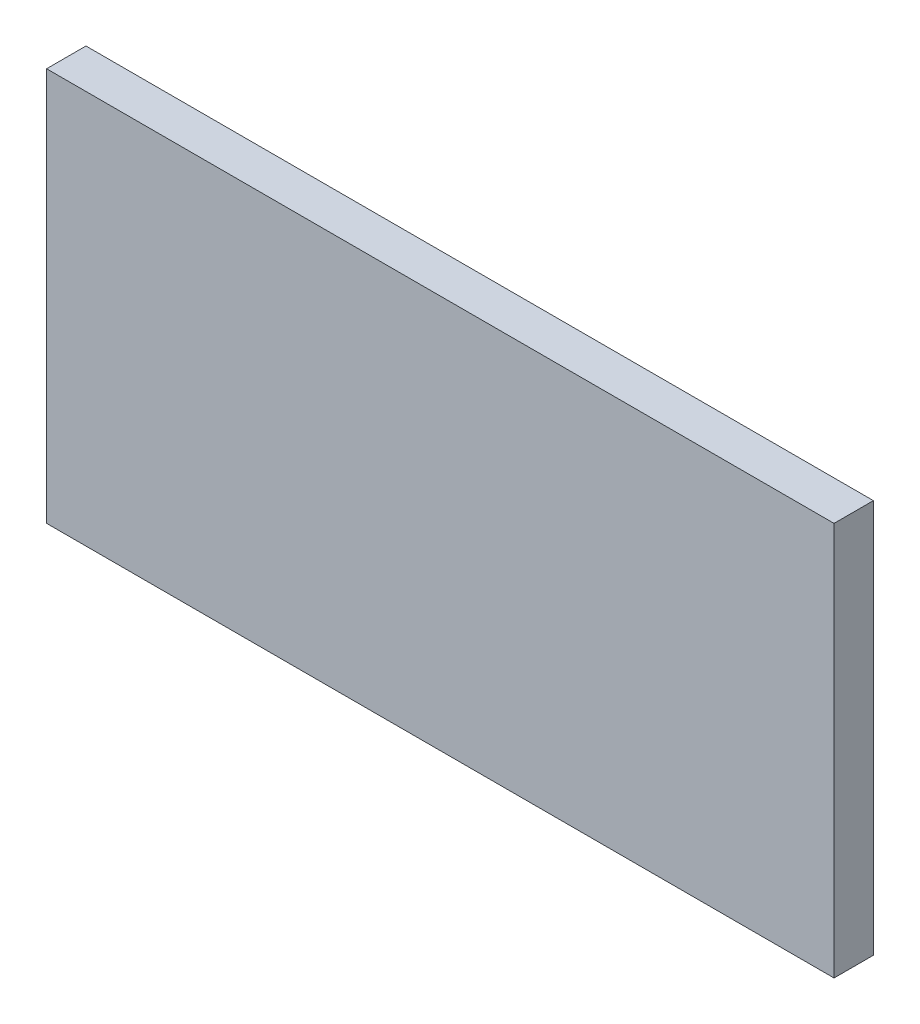
ISO-10303-21;
HEADER;
FILE_DESCRIPTION(('STEP AP214'),'2;1');
FILE_NAME('part.step','',(''),(''),'','','');
FILE_SCHEMA(('AUTOMOTIVE_DESIGN { 1 0 10303 214 1 1 1 1 }'));
ENDSEC;
DATA;
#1=APPLICATION_CONTEXT('core data for automotive mechanical design processes');
#2=APPLICATION_PROTOCOL_DEFINITION('international standard','automotive_design',2000,#1);
#3=PRODUCT_CONTEXT('',#1,'mechanical');
#4=PRODUCT('Part','Part','',(#3));
#5=PRODUCT_RELATED_PRODUCT_CATEGORY('part','',(#4));
#6=PRODUCT_DEFINITION_FORMATION('','',#4);
#7=PRODUCT_DEFINITION_CONTEXT('part definition',#1,'design');
#8=PRODUCT_DEFINITION('design','',#6,#7);
#9=PRODUCT_DEFINITION_SHAPE('','',#8);
#10=(LENGTH_UNIT() NAMED_UNIT(*) SI_UNIT(.MILLI.,.METRE.));
#11=(NAMED_UNIT(*) PLANE_ANGLE_UNIT() SI_UNIT($,.RADIAN.));
#12=(NAMED_UNIT(*) SI_UNIT($,.STERADIAN.) SOLID_ANGLE_UNIT());
#13=UNCERTAINTY_MEASURE_WITH_UNIT(LENGTH_MEASURE(1.E-05),#10,'distance_accuracy_value','');
#14=(GEOMETRIC_REPRESENTATION_CONTEXT(3) GLOBAL_UNCERTAINTY_ASSIGNED_CONTEXT((#13)) GLOBAL_UNIT_ASSIGNED_CONTEXT((#10,
#11,#12)) REPRESENTATION_CONTEXT('',''));
#15=CARTESIAN_POINT('',(0.,0.,0.));
#16=DIRECTION('',(0.,0.,1.));
#17=DIRECTION('',(1.,0.,0.));
#18=AXIS2_PLACEMENT_3D('',#15,#16,#17);
#19=CARTESIAN_POINT('',(50.,25.,5.));
#20=DIRECTION('',(-1.,0.,0.));
#21=DIRECTION('',(0.,-1.,0.));
#22=AXIS2_PLACEMENT_3D('',#19,#20,#21);
#23=PLANE('',#22);
#24=DIRECTION('',(0.,1.,0.));
#25=VECTOR('',#24,1.);
#26=CARTESIAN_POINT('',(50.,25.,0.));
#27=LINE('',#26,#25);
#28=CARTESIAN_POINT('',(50.,-25.,0.));
#29=VERTEX_POINT('',#28);
#30=CARTESIAN_POINT('',(50.,25.,0.));
#31=VERTEX_POINT('',#30);
#32=EDGE_CURVE('E96',#29,#31,#27,.T.);
#33=ORIENTED_EDGE('',*,*,#32,.T.);
#34=DIRECTION('',(0.,0.,-1.));
#35=VECTOR('',#34,1.);
#36=CARTESIAN_POINT('',(50.,25.,5.));
#37=LINE('',#36,#35);
#38=CARTESIAN_POINT('',(50.,25.,5.));
#39=VERTEX_POINT('',#38);
#40=EDGE_CURVE('E11',#39,#31,#37,.T.);
#41=ORIENTED_EDGE('',*,*,#40,.F.);
#42=DIRECTION('',(0.,1.,0.));
#43=VECTOR('',#42,1.);
#44=CARTESIAN_POINT('',(50.,25.,5.));
#45=LINE('',#44,#43);
#46=CARTESIAN_POINT('',(50.,-25.,5.));
#47=VERTEX_POINT('',#46);
#48=EDGE_CURVE('E84',#47,#39,#45,.T.);
#49=ORIENTED_EDGE('',*,*,#48,.F.);
#50=DIRECTION('',(0.,0.,-1.));
#51=VECTOR('',#50,1.);
#52=CARTESIAN_POINT('',(50.,-25.,5.));
#53=LINE('',#52,#51);
#54=EDGE_CURVE('E92',#47,#29,#53,.T.);
#55=ORIENTED_EDGE('',*,*,#54,.T.);
#56=EDGE_LOOP('',(#33,#41,#49,#55));
#57=FACE_BOUND('',#56,.T.);
#58=ADVANCED_FACE('F33',(#57),#23,.F.);
#59=CARTESIAN_POINT('',(-50.,25.,5.));
#60=DIRECTION('',(0.,-1.,0.));
#61=DIRECTION('',(0.,0.,-1.));
#62=AXIS2_PLACEMENT_3D('',#59,#60,#61);
#63=PLANE('',#62);
#64=DIRECTION('',(-1.,0.,0.));
#65=VECTOR('',#64,1.);
#66=CARTESIAN_POINT('',(-50.,25.,0.));
#67=LINE('',#66,#65);
#68=CARTESIAN_POINT('',(-50.,25.,0.));
#69=VERTEX_POINT('',#68);
#70=EDGE_CURVE('E88',#31,#69,#67,.T.);
#71=ORIENTED_EDGE('',*,*,#70,.T.);
#72=DIRECTION('',(0.,0.,-1.));
#73=VECTOR('',#72,1.);
#74=CARTESIAN_POINT('',(-50.,25.,5.));
#75=LINE('',#74,#73);
#76=CARTESIAN_POINT('',(-50.,25.,5.));
#77=VERTEX_POINT('',#76);
#78=EDGE_CURVE('E41',#77,#69,#75,.T.);
#79=ORIENTED_EDGE('',*,*,#78,.F.);
#80=DIRECTION('',(-1.,0.,0.));
#81=VECTOR('',#80,1.);
#82=CARTESIAN_POINT('',(-50.,25.,5.));
#83=LINE('',#82,#81);
#84=EDGE_CURVE('E79',#39,#77,#83,.T.);
#85=ORIENTED_EDGE('',*,*,#84,.F.);
#86=ORIENTED_EDGE('',*,*,#40,.T.);
#87=EDGE_LOOP('',(#71,#79,#85,#86));
#88=FACE_BOUND('',#87,.T.);
#89=ADVANCED_FACE('F87',(#88),#63,.F.);
#90=CARTESIAN_POINT('',(-50.,25.,5.));
#91=DIRECTION('',(1.,0.,0.));
#92=DIRECTION('',(0.,1.,0.));
#93=AXIS2_PLACEMENT_3D('',#90,#91,#92);
#94=PLANE('',#93);
#95=DIRECTION('',(0.,-1.,0.));
#96=VECTOR('',#95,1.);
#97=CARTESIAN_POINT('',(-50.,25.,0.));
#98=LINE('',#97,#96);
#99=CARTESIAN_POINT('',(-50.,-25.,0.));
#100=VERTEX_POINT('',#99);
#101=EDGE_CURVE('E66',#69,#100,#98,.T.);
#102=ORIENTED_EDGE('',*,*,#101,.T.);
#103=DIRECTION('',(0.,0.,-1.));
#104=VECTOR('',#103,1.);
#105=CARTESIAN_POINT('',(-50.,-25.,5.));
#106=LINE('',#105,#104);
#107=CARTESIAN_POINT('',(-50.,-25.,5.));
#108=VERTEX_POINT('',#107);
#109=EDGE_CURVE('E89',#108,#100,#106,.T.);
#110=ORIENTED_EDGE('',*,*,#109,.F.);
#111=DIRECTION('',(0.,-1.,0.));
#112=VECTOR('',#111,1.);
#113=CARTESIAN_POINT('',(-50.,25.,5.));
#114=LINE('',#113,#112);
#115=EDGE_CURVE('E82',#77,#108,#114,.T.);
#116=ORIENTED_EDGE('',*,*,#115,.F.);
#117=ORIENTED_EDGE('',*,*,#78,.T.);
#118=EDGE_LOOP('',(#102,#110,#116,#117));
#119=FACE_BOUND('',#118,.T.);
#120=ADVANCED_FACE('F90',(#119),#94,.F.);
#121=CARTESIAN_POINT('',(-50.,-25.,5.));
#122=DIRECTION('',(0.,1.,0.));
#123=DIRECTION('',(0.,0.,1.));
#124=AXIS2_PLACEMENT_3D('',#121,#122,#123);
#125=PLANE('',#124);
#126=DIRECTION('',(1.,0.,0.));
#127=VECTOR('',#126,1.);
#128=CARTESIAN_POINT('',(-50.,-25.,0.));
#129=LINE('',#128,#127);
#130=EDGE_CURVE('E72',#100,#29,#129,.T.);
#131=ORIENTED_EDGE('',*,*,#130,.T.);
#132=ORIENTED_EDGE('',*,*,#54,.F.);
#133=DIRECTION('',(1.,0.,0.));
#134=VECTOR('',#133,1.);
#135=CARTESIAN_POINT('',(-50.,-25.,5.));
#136=LINE('',#135,#134);
#137=EDGE_CURVE('E49',#108,#47,#136,.T.);
#138=ORIENTED_EDGE('',*,*,#137,.F.);
#139=ORIENTED_EDGE('',*,*,#109,.T.);
#140=EDGE_LOOP('',(#131,#132,#138,#139));
#141=FACE_BOUND('',#140,.T.);
#142=ADVANCED_FACE('F103',(#141),#125,.F.);
#143=CARTESIAN_POINT('',(0.,0.,5.));
#144=DIRECTION('',(0.,0.,1.));
#145=DIRECTION('',(1.,0.,0.));
#146=AXIS2_PLACEMENT_3D('',#143,#144,#145);
#147=PLANE('',#146);
#148=ORIENTED_EDGE('',*,*,#48,.T.);
#149=ORIENTED_EDGE('',*,*,#84,.T.);
#150=ORIENTED_EDGE('',*,*,#115,.T.);
#151=ORIENTED_EDGE('',*,*,#137,.T.);
#152=EDGE_LOOP('',(#148,#149,#150,#151));
#153=FACE_BOUND('',#152,.T.);
#154=ADVANCED_FACE('F80',(#153),#147,.T.);
#155=CARTESIAN_POINT('',(0.,0.,0.));
#156=DIRECTION('',(0.,0.,1.));
#157=DIRECTION('',(1.,0.,0.));
#158=AXIS2_PLACEMENT_3D('',#155,#156,#157);
#159=PLANE('',#158);
#160=ORIENTED_EDGE('',*,*,#32,.F.);
#161=ORIENTED_EDGE('',*,*,#130,.F.);
#162=ORIENTED_EDGE('',*,*,#101,.F.);
#163=ORIENTED_EDGE('',*,*,#70,.F.);
#164=EDGE_LOOP('',(#160,#161,#162,#163));
#165=FACE_BOUND('',#164,.T.);
#166=ADVANCED_FACE('F106',(#165),#159,.F.);
#167=CLOSED_SHELL('',(#58,#89,#120,#142,#154,#166));
#168=MANIFOLD_SOLID_BREP('B2',#167);
#169=ADVANCED_BREP_SHAPE_REPRESENTATION('',(#18,#168),#14);
#170=SHAPE_DEFINITION_REPRESENTATION(#9,#169);
ENDSEC;
END-ISO-10303-21;
